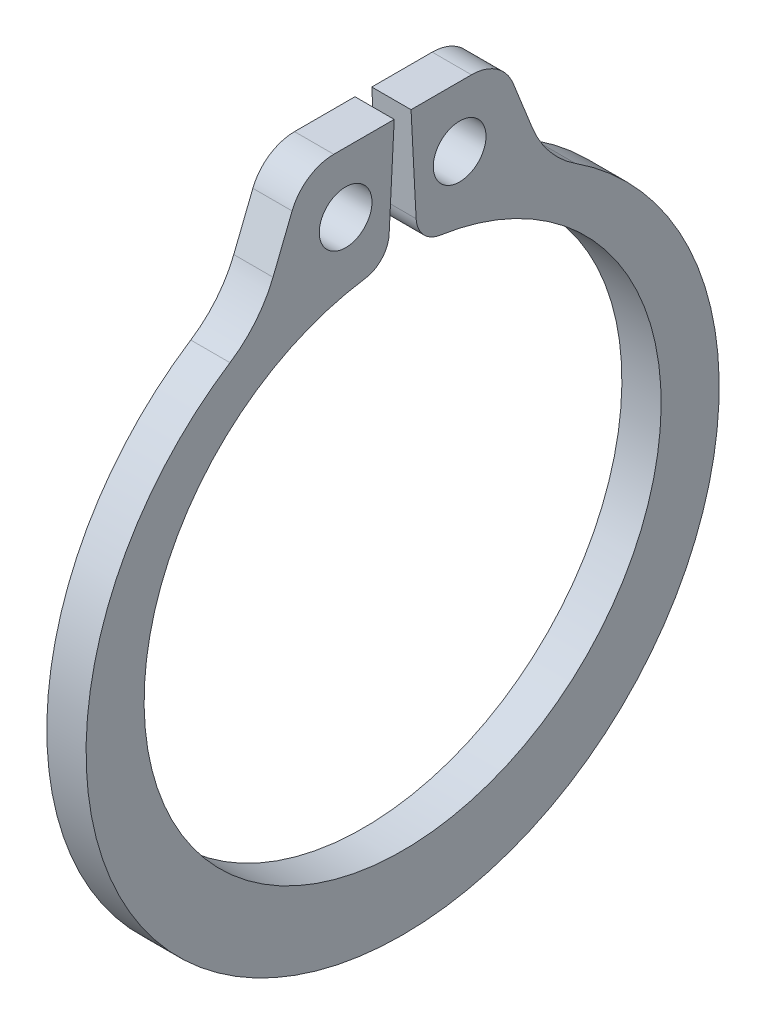
ISO-10303-21;
HEADER;
FILE_DESCRIPTION(('STEP AP214'),'2;1');
FILE_NAME('part.step','',(''),(''),'','','');
FILE_SCHEMA(('AUTOMOTIVE_DESIGN { 1 0 10303 214 1 1 1 1 }'));
ENDSEC;
DATA;
#1=APPLICATION_CONTEXT('core data for automotive mechanical design processes');
#2=APPLICATION_PROTOCOL_DEFINITION('international standard','automotive_design',2000,#1);
#3=PRODUCT_CONTEXT('',#1,'mechanical');
#4=PRODUCT('Part','Part','',(#3));
#5=PRODUCT_RELATED_PRODUCT_CATEGORY('part','',(#4));
#6=PRODUCT_DEFINITION_FORMATION('','',#4);
#7=PRODUCT_DEFINITION_CONTEXT('part definition',#1,'design');
#8=PRODUCT_DEFINITION('design','',#6,#7);
#9=PRODUCT_DEFINITION_SHAPE('','',#8);
#10=(LENGTH_UNIT() NAMED_UNIT(*) SI_UNIT(.MILLI.,.METRE.));
#11=(NAMED_UNIT(*) PLANE_ANGLE_UNIT() SI_UNIT($,.RADIAN.));
#12=(NAMED_UNIT(*) SI_UNIT($,.STERADIAN.) SOLID_ANGLE_UNIT());
#13=UNCERTAINTY_MEASURE_WITH_UNIT(LENGTH_MEASURE(1.E-05),#10,'distance_accuracy_value','');
#14=(GEOMETRIC_REPRESENTATION_CONTEXT(3) GLOBAL_UNCERTAINTY_ASSIGNED_CONTEXT((#13)) GLOBAL_UNIT_ASSIGNED_CONTEXT((#10,
#11,#12)) REPRESENTATION_CONTEXT('',''));
#15=CARTESIAN_POINT('',(0.,0.,0.));
#16=DIRECTION('',(0.,0.,1.));
#17=DIRECTION('',(1.,0.,0.));
#18=AXIS2_PLACEMENT_3D('',#15,#16,#17);
#19=CARTESIAN_POINT('',(0.4445,-0.336753666382073,0.));
#20=DIRECTION('',(1.,0.,0.));
#21=DIRECTION('',(0.,0.,-1.));
#22=AXIS2_PLACEMENT_3D('',#19,#20,#21);
#23=PLANE('',#22);
#24=CARTESIAN_POINT('',(0.4445,7.21488157342687,1.29098399758281));
#25=DIRECTION('',(1.,0.,0.));
#26=DIRECTION('',(0.,0.,-1.));
#27=AXIS2_PLACEMENT_3D('',#24,#25,#26);
#28=CIRCLE('',#27,0.5969);
#29=CARTESIAN_POINT('',(0.4445,7.21488157342687,0.694083997582812));
#30=VERTEX_POINT('',#29);
#31=EDGE_CURVE('E181',#30,#30,#28,.T.);
#32=ORIENTED_EDGE('',*,*,#31,.F.);
#33=EDGE_LOOP('',(#32));
#34=FACE_BOUND('',#33,.T.);
#35=DIRECTION('',(0.,0.928920919133525,0.370278173804678));
#36=VECTOR('',#35,1.);
#37=CARTESIAN_POINT('',(0.4445,8.58460184329625,-2.2479));
#38=LINE('',#37,#36);
#39=CARTESIAN_POINT('',(0.4445,6.86113480548332,-2.93489306284241));
#40=VERTEX_POINT('',#39);
#41=CARTESIAN_POINT('',(0.4445,7.9448044678818,-2.50293032485743));
#42=VERTEX_POINT('',#41);
#43=EDGE_CURVE('E187',#40,#42,#38,.T.);
#44=ORIENTED_EDGE('',*,*,#43,.T.);
#45=CARTESIAN_POINT('',(0.4445,7.56860184329625,-1.55914667101777));
#46=DIRECTION('',(1.,0.,0.));
#47=DIRECTION('',(0.,0.,-1.));
#48=AXIS2_PLACEMENT_3D('',#45,#46,#47);
#49=CIRCLE('',#48,1.016);
#50=CARTESIAN_POINT('',(0.4445,8.58460184329625,-1.55914667101777));
#51=VERTEX_POINT('',#50);
#52=EDGE_CURVE('E248',#42,#51,#49,.T.);
#53=ORIENTED_EDGE('',*,*,#52,.T.);
#54=DIRECTION('',(0.,0.,1.));
#55=VECTOR('',#54,1.);
#56=CARTESIAN_POINT('',(0.4445,8.58460184329625,-0.1905));
#57=LINE('',#56,#55);
#58=CARTESIAN_POINT('',(0.4445,8.58460184329625,-0.1905));
#59=VERTEX_POINT('',#58);
#60=EDGE_CURVE('E190',#51,#59,#57,.T.);
#61=ORIENTED_EDGE('',*,*,#60,.T.);
#62=DIRECTION('',(0.,-0.998629534754574,-0.0523359562429374));
#63=VECTOR('',#62,1.);
#64=CARTESIAN_POINT('',(0.4445,8.58460184329625,-0.1905));
#65=LINE('',#64,#63);
#66=CARTESIAN_POINT('',(0.4445,6.38806597718214,-0.305615566858578));
#67=VERTEX_POINT('',#66);
#68=EDGE_CURVE('E159',#59,#67,#65,.T.);
#69=ORIENTED_EDGE('',*,*,#68,.T.);
#70=CARTESIAN_POINT('',(0.4445,6.4212993093964,-0.939745321427733));
#71=DIRECTION('',(1.,0.,0.));
#72=DIRECTION('',(0.,0.,-1.));
#73=AXIS2_PLACEMENT_3D('',#70,#71,#72);
#74=CIRCLE('',#73,0.635);
#75=CARTESIAN_POINT('',(0.4445,5.79299213626564,-0.847793724419148));
#76=VERTEX_POINT('',#75);
#77=EDGE_CURVE('E235',#67,#76,#74,.T.);
#78=ORIENTED_EDGE('',*,*,#77,.T.);
#79=CARTESIAN_POINT('',(0.4445,0.,0.));
#80=DIRECTION('',(-1.,0.,0.));
#81=DIRECTION('',(0.,0.,-1.));
#82=AXIS2_PLACEMENT_3D('',#79,#80,#81);
#83=CIRCLE('',#82,5.8547);
#84=CARTESIAN_POINT('',(0.4445,5.79299213626564,0.847793724419148));
#85=VERTEX_POINT('',#84);
#86=EDGE_CURVE('E193',#76,#85,#83,.T.);
#87=ORIENTED_EDGE('',*,*,#86,.T.);
#88=CARTESIAN_POINT('',(0.4445,6.4212993093964,0.939745321427733));
#89=DIRECTION('',(1.,0.,0.));
#90=DIRECTION('',(0.,0.,-1.));
#91=AXIS2_PLACEMENT_3D('',#88,#89,#90);
#92=CIRCLE('',#91,0.635);
#93=CARTESIAN_POINT('',(0.4445,6.38806597718214,0.305615566858577));
#94=VERTEX_POINT('',#93);
#95=EDGE_CURVE('E233',#85,#94,#92,.T.);
#96=ORIENTED_EDGE('',*,*,#95,.T.);
#97=DIRECTION('',(0.,0.998629534754574,-0.0523359562429371));
#98=VECTOR('',#97,1.);
#99=CARTESIAN_POINT('',(0.4445,5.8451613035575,0.334067995165625));
#100=LINE('',#99,#98);
#101=CARTESIAN_POINT('',(0.4445,8.58460184329625,0.1905));
#102=VERTEX_POINT('',#101);
#103=EDGE_CURVE('E196',#94,#102,#100,.T.);
#104=ORIENTED_EDGE('',*,*,#103,.T.);
#105=DIRECTION('',(0.,0.,1.));
#106=VECTOR('',#105,1.);
#107=CARTESIAN_POINT('',(0.4445,8.58460184329625,0.1905));
#108=LINE('',#107,#106);
#109=CARTESIAN_POINT('',(0.4445,8.58460184329625,1.55914667101777));
#110=VERTEX_POINT('',#109);
#111=EDGE_CURVE('E198',#102,#110,#108,.T.);
#112=ORIENTED_EDGE('',*,*,#111,.T.);
#113=CARTESIAN_POINT('',(0.4445,7.56860184329625,1.55914667101777));
#114=DIRECTION('',(1.,0.,0.));
#115=DIRECTION('',(0.,0.,-1.));
#116=AXIS2_PLACEMENT_3D('',#113,#114,#115);
#117=CIRCLE('',#116,1.016);
#118=CARTESIAN_POINT('',(0.4445,7.9448044678818,2.50293032485743));
#119=VERTEX_POINT('',#118);
#120=EDGE_CURVE('E54',#110,#119,#117,.T.);
#121=ORIENTED_EDGE('',*,*,#120,.T.);
#122=DIRECTION('',(0.,-0.928920919133524,0.370278173804679));
#123=VECTOR('',#122,1.);
#124=CARTESIAN_POINT('',(0.4445,8.58460184329625,2.2479));
#125=LINE('',#124,#123);
#126=CARTESIAN_POINT('',(0.4445,6.86113480548332,2.93489306284241));
#127=VERTEX_POINT('',#126);
#128=EDGE_CURVE('E200',#119,#127,#125,.T.);
#129=ORIENTED_EDGE('',*,*,#128,.T.);
#130=CARTESIAN_POINT('',(0.4445,7.8016413669472,5.29435219744157));
#131=DIRECTION('',(1.,0.,0.));
#132=DIRECTION('',(0.,0.,-1.));
#133=AXIS2_PLACEMENT_3D('',#130,#131,#132);
#134=CIRCLE('',#133,2.54);
#135=CARTESIAN_POINT('',(0.4445,5.67252017558994,3.90927351645863));
#136=VERTEX_POINT('',#135);
#137=EDGE_CURVE('E221',#127,#136,#134,.F.);
#138=ORIENTED_EDGE('',*,*,#137,.T.);
#139=CARTESIAN_POINT('',(0.4445,-0.336753666382073,0.));
#140=DIRECTION('',(1.,0.,0.));
#141=DIRECTION('',(0.,0.,-1.));
#142=AXIS2_PLACEMENT_3D('',#139,#140,#141);
#143=CIRCLE('',#142,7.16894633361793);
#144=CARTESIAN_POINT('',(0.4445,5.67252017558994,-3.90927351645864));
#145=VERTEX_POINT('',#144);
#146=EDGE_CURVE('E184',#136,#145,#143,.T.);
#147=ORIENTED_EDGE('',*,*,#146,.T.);
#148=CARTESIAN_POINT('',(0.4445,7.8016413669472,-5.29435219744157));
#149=DIRECTION('',(1.,0.,0.));
#150=DIRECTION('',(0.,0.,-1.));
#151=AXIS2_PLACEMENT_3D('',#148,#149,#150);
#152=CIRCLE('',#151,2.54);
#153=EDGE_CURVE('E216',#145,#40,#152,.F.);
#154=ORIENTED_EDGE('',*,*,#153,.T.);
#155=EDGE_LOOP('',(#44,#53,#61,#69,#78,#87,#96,#104,#112,#121,#129,#138,#147,#154));
#156=FACE_BOUND('',#155,.T.);
#157=CARTESIAN_POINT('',(0.4445,7.21488157342687,-1.29098399758281));
#158=DIRECTION('',(1.,0.,0.));
#159=DIRECTION('',(0.,0.,-1.));
#160=AXIS2_PLACEMENT_3D('',#157,#158,#159);
#161=CIRCLE('',#160,0.5969);
#162=CARTESIAN_POINT('',(0.4445,7.21488157342687,-1.88788399758281));
#163=VERTEX_POINT('',#162);
#164=EDGE_CURVE('E178',#163,#163,#161,.T.);
#165=ORIENTED_EDGE('',*,*,#164,.F.);
#166=EDGE_LOOP('',(#165));
#167=FACE_BOUND('',#166,.T.);
#168=ADVANCED_FACE('F39',(#34,#156,#167),#23,.T.);
#169=CARTESIAN_POINT('',(0.4445,-0.336753666382073,0.));
#170=DIRECTION('',(-1.,0.,0.));
#171=DIRECTION('',(0.,0.,1.));
#172=AXIS2_PLACEMENT_3D('',#169,#170,#171);
#173=CYLINDRICAL_SURFACE('',#172,7.16894633361793);
#174=CARTESIAN_POINT('',(-0.4445,-0.336753666382073,0.));
#175=DIRECTION('',(1.,0.,0.));
#176=DIRECTION('',(0.,0.,-1.));
#177=AXIS2_PLACEMENT_3D('',#174,#175,#176);
#178=CIRCLE('',#177,7.16894633361793);
#179=CARTESIAN_POINT('',(-0.4445,5.67252017558994,3.90927351645863));
#180=VERTEX_POINT('',#179);
#181=CARTESIAN_POINT('',(-0.4445,5.67252017558994,-3.90927351645864));
#182=VERTEX_POINT('',#181);
#183=EDGE_CURVE('E259',#180,#182,#178,.T.);
#184=ORIENTED_EDGE('',*,*,#183,.T.);
#185=DIRECTION('',(-1.,0.,0.));
#186=VECTOR('',#185,1.);
#187=CARTESIAN_POINT('',(0.4445,5.67252017558994,-3.90927351645864));
#188=LINE('',#187,#186);
#189=EDGE_CURVE('E209',#182,#145,#188,.F.);
#190=ORIENTED_EDGE('',*,*,#189,.T.);
#191=ORIENTED_EDGE('',*,*,#146,.F.);
#192=DIRECTION('',(-1.,0.,0.));
#193=VECTOR('',#192,1.);
#194=CARTESIAN_POINT('',(0.4445,5.67252017558994,3.90927351645863));
#195=LINE('',#194,#193);
#196=EDGE_CURVE('E206',#136,#180,#195,.T.);
#197=ORIENTED_EDGE('',*,*,#196,.T.);
#198=EDGE_LOOP('',(#184,#190,#191,#197));
#199=FACE_BOUND('',#198,.T.);
#200=ADVANCED_FACE('F268',(#199),#173,.T.);
#201=CARTESIAN_POINT('',(0.4445,8.58460184329625,-2.2479));
#202=DIRECTION('',(0.,-0.370278173804678,0.928920919133525));
#203=DIRECTION('',(0.,-0.928920919133525,-0.370278173804678));
#204=AXIS2_PLACEMENT_3D('',#201,#202,#203);
#205=PLANE('',#204);
#206=DIRECTION('',(0.,0.928920919133525,0.370278173804678));
#207=VECTOR('',#206,1.);
#208=CARTESIAN_POINT('',(-0.4445,8.58460184329625,-2.2479));
#209=LINE('',#208,#207);
#210=CARTESIAN_POINT('',(-0.4445,6.86113480548332,-2.93489306284241));
#211=VERTEX_POINT('',#210);
#212=CARTESIAN_POINT('',(-0.4445,7.9448044678818,-2.50293032485743));
#213=VERTEX_POINT('',#212);
#214=EDGE_CURVE('E152',#211,#213,#209,.T.);
#215=ORIENTED_EDGE('',*,*,#214,.T.);
#216=DIRECTION('',(-1.,0.,0.));
#217=VECTOR('',#216,1.);
#218=CARTESIAN_POINT('',(0.4445,7.9448044678818,-2.50293032485743));
#219=LINE('',#218,#217);
#220=EDGE_CURVE('E245',#213,#42,#219,.F.);
#221=ORIENTED_EDGE('',*,*,#220,.T.);
#222=ORIENTED_EDGE('',*,*,#43,.F.);
#223=DIRECTION('',(1.,0.,0.));
#224=VECTOR('',#223,1.);
#225=CARTESIAN_POINT('',(-0.4445,6.86113480548332,-2.93489306284241));
#226=LINE('',#225,#224);
#227=EDGE_CURVE('E160',#40,#211,#226,.F.);
#228=ORIENTED_EDGE('',*,*,#227,.T.);
#229=EDGE_LOOP('',(#215,#221,#222,#228));
#230=FACE_BOUND('',#229,.T.);
#231=ADVANCED_FACE('F277',(#230),#205,.F.);
#232=CARTESIAN_POINT('',(0.4445,8.58460184329625,-0.1905));
#233=DIRECTION('',(0.,-1.,0.));
#234=DIRECTION('',(0.,0.,-1.));
#235=AXIS2_PLACEMENT_3D('',#232,#233,#234);
#236=PLANE('',#235);
#237=ORIENTED_EDGE('',*,*,#60,.F.);
#238=DIRECTION('',(-1.,0.,0.));
#239=VECTOR('',#238,1.);
#240=CARTESIAN_POINT('',(0.4445,8.58460184329625,-1.55914667101777));
#241=LINE('',#240,#239);
#242=CARTESIAN_POINT('',(-0.4445,8.58460184329625,-1.55914667101777));
#243=VERTEX_POINT('',#242);
#244=EDGE_CURVE('E148',#51,#243,#241,.T.);
#245=ORIENTED_EDGE('',*,*,#244,.T.);
#246=DIRECTION('',(0.,0.,1.));
#247=VECTOR('',#246,1.);
#248=CARTESIAN_POINT('',(-0.4445,8.58460184329625,-0.1905));
#249=LINE('',#248,#247);
#250=CARTESIAN_POINT('',(-0.4445,8.58460184329625,-0.1905));
#251=VERTEX_POINT('',#250);
#252=EDGE_CURVE('E141',#243,#251,#249,.T.);
#253=ORIENTED_EDGE('',*,*,#252,.T.);
#254=DIRECTION('',(-1.,0.,0.));
#255=VECTOR('',#254,1.);
#256=CARTESIAN_POINT('',(0.4445,8.58460184329625,-0.1905));
#257=LINE('',#256,#255);
#258=EDGE_CURVE('E145',#59,#251,#257,.T.);
#259=ORIENTED_EDGE('',*,*,#258,.F.);
#260=EDGE_LOOP('',(#237,#245,#253,#259));
#261=FACE_BOUND('',#260,.T.);
#262=ADVANCED_FACE('F144',(#261),#236,.F.);
#263=CARTESIAN_POINT('',(0.4445,8.58460184329625,-0.1905));
#264=DIRECTION('',(0.,0.0523359562429374,-0.998629534754574));
#265=DIRECTION('',(0.,0.998629534754574,0.0523359562429374));
#266=AXIS2_PLACEMENT_3D('',#263,#264,#265);
#267=PLANE('',#266);
#268=DIRECTION('',(0.,-0.998629534754574,-0.0523359562429374));
#269=VECTOR('',#268,1.);
#270=CARTESIAN_POINT('',(-0.4445,8.58460184329625,-0.1905));
#271=LINE('',#270,#269);
#272=CARTESIAN_POINT('',(-0.4445,6.38806597718214,-0.305615566858578));
#273=VERTEX_POINT('',#272);
#274=EDGE_CURVE('E151',#251,#273,#271,.T.);
#275=ORIENTED_EDGE('',*,*,#274,.T.);
#276=DIRECTION('',(-1.,0.,0.));
#277=VECTOR('',#276,1.);
#278=CARTESIAN_POINT('',(0.4445,6.38806597718214,-0.305615566858578));
#279=LINE('',#278,#277);
#280=EDGE_CURVE('E231',#273,#67,#279,.F.);
#281=ORIENTED_EDGE('',*,*,#280,.T.);
#282=ORIENTED_EDGE('',*,*,#68,.F.);
#283=ORIENTED_EDGE('',*,*,#258,.T.);
#284=EDGE_LOOP('',(#275,#281,#282,#283));
#285=FACE_BOUND('',#284,.T.);
#286=ADVANCED_FACE('F156',(#285),#267,.F.);
#287=CARTESIAN_POINT('',(0.4445,0.,0.));
#288=DIRECTION('',(-1.,0.,0.));
#289=DIRECTION('',(0.,0.,1.));
#290=AXIS2_PLACEMENT_3D('',#287,#288,#289);
#291=CYLINDRICAL_SURFACE('',#290,5.8547);
#292=ORIENTED_EDGE('',*,*,#86,.F.);
#293=DIRECTION('',(-1.,0.,0.));
#294=VECTOR('',#293,1.);
#295=CARTESIAN_POINT('',(0.4445,5.79299213626564,-0.847793724419148));
#296=LINE('',#295,#294);
#297=CARTESIAN_POINT('',(-0.4445,5.79299213626564,-0.847793724419148));
#298=VERTEX_POINT('',#297);
#299=EDGE_CURVE('E225',#76,#298,#296,.T.);
#300=ORIENTED_EDGE('',*,*,#299,.T.);
#301=CARTESIAN_POINT('',(-0.4445,0.,0.));
#302=DIRECTION('',(-1.,0.,0.));
#303=DIRECTION('',(0.,0.,-1.));
#304=AXIS2_PLACEMENT_3D('',#301,#302,#303);
#305=CIRCLE('',#304,5.8547);
#306=CARTESIAN_POINT('',(-0.4445,5.79299213626564,0.847793724419148));
#307=VERTEX_POINT('',#306);
#308=EDGE_CURVE('E166',#298,#307,#305,.T.);
#309=ORIENTED_EDGE('',*,*,#308,.T.);
#310=DIRECTION('',(-1.,0.,0.));
#311=VECTOR('',#310,1.);
#312=CARTESIAN_POINT('',(0.4445,5.79299213626564,0.847793724419148));
#313=LINE('',#312,#311);
#314=EDGE_CURVE('E223',#307,#85,#313,.F.);
#315=ORIENTED_EDGE('',*,*,#314,.T.);
#316=EDGE_LOOP('',(#292,#300,#309,#315));
#317=FACE_BOUND('',#316,.T.);
#318=ADVANCED_FACE('F288',(#317),#291,.F.);
#319=CARTESIAN_POINT('',(0.4445,5.8451613035575,0.334067995165625));
#320=DIRECTION('',(0.,0.0523359562429371,0.998629534754574));
#321=DIRECTION('',(0.,-0.998629534754574,0.0523359562429371));
#322=AXIS2_PLACEMENT_3D('',#319,#320,#321);
#323=PLANE('',#322);
#324=ORIENTED_EDGE('',*,*,#103,.F.);
#325=DIRECTION('',(-1.,0.,0.));
#326=VECTOR('',#325,1.);
#327=CARTESIAN_POINT('',(0.4445,6.38806597718214,0.305615566858577));
#328=LINE('',#327,#326);
#329=CARTESIAN_POINT('',(-0.4445,6.38806597718214,0.305615566858577));
#330=VERTEX_POINT('',#329);
#331=EDGE_CURVE('E237',#94,#330,#328,.T.);
#332=ORIENTED_EDGE('',*,*,#331,.T.);
#333=DIRECTION('',(0.,0.998629534754574,-0.0523359562429371));
#334=VECTOR('',#333,1.);
#335=CARTESIAN_POINT('',(-0.4445,5.8451613035575,0.334067995165625));
#336=LINE('',#335,#334);
#337=CARTESIAN_POINT('',(-0.4445,8.58460184329625,0.1905));
#338=VERTEX_POINT('',#337);
#339=EDGE_CURVE('E169',#330,#338,#336,.T.);
#340=ORIENTED_EDGE('',*,*,#339,.T.);
#341=DIRECTION('',(-1.,0.,0.));
#342=VECTOR('',#341,1.);
#343=CARTESIAN_POINT('',(0.4445,8.58460184329625,0.1905));
#344=LINE('',#343,#342);
#345=EDGE_CURVE('E161',#102,#338,#344,.T.);
#346=ORIENTED_EDGE('',*,*,#345,.F.);
#347=EDGE_LOOP('',(#324,#332,#340,#346));
#348=FACE_BOUND('',#347,.T.);
#349=ADVANCED_FACE('F297',(#348),#323,.F.);
#350=CARTESIAN_POINT('',(0.4445,8.58460184329625,0.1905));
#351=DIRECTION('',(0.,-1.,0.));
#352=DIRECTION('',(0.,0.,-1.));
#353=AXIS2_PLACEMENT_3D('',#350,#351,#352);
#354=PLANE('',#353);
#355=DIRECTION('',(0.,0.,1.));
#356=VECTOR('',#355,1.);
#357=CARTESIAN_POINT('',(-0.4445,8.58460184329625,0.1905));
#358=LINE('',#357,#356);
#359=CARTESIAN_POINT('',(-0.4445,8.58460184329625,1.55914667101777));
#360=VERTEX_POINT('',#359);
#361=EDGE_CURVE('E174',#338,#360,#358,.T.);
#362=ORIENTED_EDGE('',*,*,#361,.T.);
#363=DIRECTION('',(-1.,0.,0.));
#364=VECTOR('',#363,1.);
#365=CARTESIAN_POINT('',(0.4445,8.58460184329625,1.55914667101777));
#366=LINE('',#365,#364);
#367=EDGE_CURVE('E11',#360,#110,#366,.F.);
#368=ORIENTED_EDGE('',*,*,#367,.T.);
#369=ORIENTED_EDGE('',*,*,#111,.F.);
#370=ORIENTED_EDGE('',*,*,#345,.T.);
#371=EDGE_LOOP('',(#362,#368,#369,#370));
#372=FACE_BOUND('',#371,.T.);
#373=ADVANCED_FACE('F317',(#372),#354,.F.);
#374=CARTESIAN_POINT('',(0.4445,8.58460184329625,2.2479));
#375=DIRECTION('',(0.,-0.370278173804679,-0.928920919133524));
#376=DIRECTION('',(0.,0.928920919133525,-0.370278173804679));
#377=AXIS2_PLACEMENT_3D('',#374,#375,#376);
#378=PLANE('',#377);
#379=ORIENTED_EDGE('',*,*,#128,.F.);
#380=DIRECTION('',(-1.,0.,0.));
#381=VECTOR('',#380,1.);
#382=CARTESIAN_POINT('',(0.4445,7.9448044678818,2.50293032485743));
#383=LINE('',#382,#381);
#384=CARTESIAN_POINT('',(-0.4445,7.9448044678818,2.50293032485743));
#385=VERTEX_POINT('',#384);
#386=EDGE_CURVE('E47',#119,#385,#383,.T.);
#387=ORIENTED_EDGE('',*,*,#386,.T.);
#388=DIRECTION('',(0.,-0.928920919133524,0.370278173804679));
#389=VECTOR('',#388,1.);
#390=CARTESIAN_POINT('',(-0.4445,8.58460184329625,2.2479));
#391=LINE('',#390,#389);
#392=CARTESIAN_POINT('',(-0.4445,6.86113480548332,2.93489306284241));
#393=VERTEX_POINT('',#392);
#394=EDGE_CURVE('E176',#385,#393,#391,.T.);
#395=ORIENTED_EDGE('',*,*,#394,.T.);
#396=DIRECTION('',(1.,0.,0.));
#397=VECTOR('',#396,1.);
#398=CARTESIAN_POINT('',(0.4445,6.86113480548332,2.93489306284241));
#399=LINE('',#398,#397);
#400=EDGE_CURVE('E211',#393,#127,#399,.T.);
#401=ORIENTED_EDGE('',*,*,#400,.T.);
#402=EDGE_LOOP('',(#379,#387,#395,#401));
#403=FACE_BOUND('',#402,.T.);
#404=ADVANCED_FACE('F253',(#403),#378,.F.);
#405=CARTESIAN_POINT('',(0.4445,7.21488157342687,1.29098399758281));
#406=DIRECTION('',(-1.,0.,0.));
#407=DIRECTION('',(0.,0.,1.));
#408=AXIS2_PLACEMENT_3D('',#405,#406,#407);
#409=CYLINDRICAL_SURFACE('',#408,0.5969);
#410=ORIENTED_EDGE('',*,*,#31,.T.);
#411=EDGE_LOOP('',(#410));
#412=FACE_BOUND('',#411,.T.);
#413=CARTESIAN_POINT('',(-0.4445,7.21488157342687,1.29098399758281));
#414=DIRECTION('',(1.,0.,0.));
#415=DIRECTION('',(0.,0.,-1.));
#416=AXIS2_PLACEMENT_3D('',#413,#414,#415);
#417=CIRCLE('',#416,0.5969);
#418=CARTESIAN_POINT('',(-0.4445,7.21488157342687,0.694083997582812));
#419=VERTEX_POINT('',#418);
#420=EDGE_CURVE('E452',#419,#419,#417,.T.);
#421=ORIENTED_EDGE('',*,*,#420,.F.);
#422=EDGE_LOOP('',(#421));
#423=FACE_BOUND('',#422,.T.);
#424=ADVANCED_FACE('F313',(#412,#423),#409,.F.);
#425=CARTESIAN_POINT('',(0.4445,7.21488157342687,-1.29098399758281));
#426=DIRECTION('',(-1.,0.,0.));
#427=DIRECTION('',(0.,0.,1.));
#428=AXIS2_PLACEMENT_3D('',#425,#426,#427);
#429=CYLINDRICAL_SURFACE('',#428,0.5969);
#430=ORIENTED_EDGE('',*,*,#164,.T.);
#431=EDGE_LOOP('',(#430));
#432=FACE_BOUND('',#431,.T.);
#433=CARTESIAN_POINT('',(-0.4445,7.21488157342687,-1.29098399758281));
#434=DIRECTION('',(1.,0.,0.));
#435=DIRECTION('',(0.,0.,-1.));
#436=AXIS2_PLACEMENT_3D('',#433,#434,#435);
#437=CIRCLE('',#436,0.5969);
#438=CARTESIAN_POINT('',(-0.4445,7.21488157342687,-1.88788399758281));
#439=VERTEX_POINT('',#438);
#440=EDGE_CURVE('E454',#439,#439,#437,.T.);
#441=ORIENTED_EDGE('',*,*,#440,.F.);
#442=EDGE_LOOP('',(#441));
#443=FACE_BOUND('',#442,.T.);
#444=ADVANCED_FACE('F358',(#432,#443),#429,.F.);
#445=CARTESIAN_POINT('',(-0.4445,-0.336753666382073,0.));
#446=DIRECTION('',(1.,0.,0.));
#447=DIRECTION('',(0.,0.,-1.));
#448=AXIS2_PLACEMENT_3D('',#445,#446,#447);
#449=PLANE('',#448);
#450=ORIENTED_EDGE('',*,*,#440,.T.);
#451=EDGE_LOOP('',(#450));
#452=FACE_BOUND('',#451,.T.);
#453=ORIENTED_EDGE('',*,*,#420,.T.);
#454=EDGE_LOOP('',(#453));
#455=FACE_BOUND('',#454,.T.);
#456=ORIENTED_EDGE('',*,*,#252,.F.);
#457=CARTESIAN_POINT('',(-0.4445,7.56860184329625,-1.55914667101777));
#458=DIRECTION('',(1.,0.,0.));
#459=DIRECTION('',(0.,0.,-1.));
#460=AXIS2_PLACEMENT_3D('',#457,#458,#459);
#461=CIRCLE('',#460,1.016);
#462=EDGE_CURVE('E243',#243,#213,#461,.F.);
#463=ORIENTED_EDGE('',*,*,#462,.T.);
#464=ORIENTED_EDGE('',*,*,#214,.F.);
#465=CARTESIAN_POINT('',(-0.4445,7.8016413669472,-5.29435219744157));
#466=DIRECTION('',(1.,0.,0.));
#467=DIRECTION('',(0.,0.,-1.));
#468=AXIS2_PLACEMENT_3D('',#465,#466,#467);
#469=CIRCLE('',#468,2.54);
#470=EDGE_CURVE('E214',#211,#182,#469,.T.);
#471=ORIENTED_EDGE('',*,*,#470,.T.);
#472=ORIENTED_EDGE('',*,*,#183,.F.);
#473=CARTESIAN_POINT('',(-0.4445,7.8016413669472,5.29435219744157));
#474=DIRECTION('',(1.,0.,0.));
#475=DIRECTION('',(0.,0.,-1.));
#476=AXIS2_PLACEMENT_3D('',#473,#474,#475);
#477=CIRCLE('',#476,2.54);
#478=EDGE_CURVE('E218',#180,#393,#477,.T.);
#479=ORIENTED_EDGE('',*,*,#478,.T.);
#480=ORIENTED_EDGE('',*,*,#394,.F.);
#481=CARTESIAN_POINT('',(-0.4445,7.56860184329625,1.55914667101777));
#482=DIRECTION('',(1.,0.,0.));
#483=DIRECTION('',(0.,0.,-1.));
#484=AXIS2_PLACEMENT_3D('',#481,#482,#483);
#485=CIRCLE('',#484,1.016);
#486=EDGE_CURVE('E241',#385,#360,#485,.F.);
#487=ORIENTED_EDGE('',*,*,#486,.T.);
#488=ORIENTED_EDGE('',*,*,#361,.F.);
#489=ORIENTED_EDGE('',*,*,#339,.F.);
#490=CARTESIAN_POINT('',(-0.4445,6.4212993093964,0.939745321427733));
#491=DIRECTION('',(1.,0.,0.));
#492=DIRECTION('',(0.,0.,-1.));
#493=AXIS2_PLACEMENT_3D('',#490,#491,#492);
#494=CIRCLE('',#493,0.635);
#495=EDGE_CURVE('E228',#330,#307,#494,.F.);
#496=ORIENTED_EDGE('',*,*,#495,.T.);
#497=ORIENTED_EDGE('',*,*,#308,.F.);
#498=CARTESIAN_POINT('',(-0.4445,6.4212993093964,-0.939745321427733));
#499=DIRECTION('',(1.,0.,0.));
#500=DIRECTION('',(0.,0.,-1.));
#501=AXIS2_PLACEMENT_3D('',#498,#499,#500);
#502=CIRCLE('',#501,0.635);
#503=EDGE_CURVE('E165',#298,#273,#502,.F.);
#504=ORIENTED_EDGE('',*,*,#503,.T.);
#505=ORIENTED_EDGE('',*,*,#274,.F.);
#506=EDGE_LOOP('',(#456,#463,#464,#471,#472,#479,#480,#487,#488,#489,#496,#497,#504,#505));
#507=FACE_BOUND('',#506,.T.);
#508=ADVANCED_FACE('F163',(#452,#455,#507),#449,.F.);
#509=CARTESIAN_POINT('',(0.4445,7.8016413669472,-5.29435219744157));
#510=DIRECTION('',(-1.,0.,0.));
#511=DIRECTION('',(0.,0.,1.));
#512=AXIS2_PLACEMENT_3D('',#509,#510,#511);
#513=CYLINDRICAL_SURFACE('',#512,2.54);
#514=ORIENTED_EDGE('',*,*,#153,.F.);
#515=ORIENTED_EDGE('',*,*,#189,.F.);
#516=ORIENTED_EDGE('',*,*,#470,.F.);
#517=ORIENTED_EDGE('',*,*,#227,.F.);
#518=EDGE_LOOP('',(#514,#515,#516,#517));
#519=FACE_BOUND('',#518,.T.);
#520=ADVANCED_FACE('F271',(#519),#513,.F.);
#521=CARTESIAN_POINT('',(0.4445,7.8016413669472,5.29435219744157));
#522=DIRECTION('',(-1.,0.,0.));
#523=DIRECTION('',(0.,0.,1.));
#524=AXIS2_PLACEMENT_3D('',#521,#522,#523);
#525=CYLINDRICAL_SURFACE('',#524,2.54);
#526=ORIENTED_EDGE('',*,*,#137,.F.);
#527=ORIENTED_EDGE('',*,*,#400,.F.);
#528=ORIENTED_EDGE('',*,*,#478,.F.);
#529=ORIENTED_EDGE('',*,*,#196,.F.);
#530=EDGE_LOOP('',(#526,#527,#528,#529));
#531=FACE_BOUND('',#530,.T.);
#532=ADVANCED_FACE('F263',(#531),#525,.F.);
#533=CARTESIAN_POINT('',(0.4445,6.4212993093964,-0.939745321427733));
#534=DIRECTION('',(-1.,0.,0.));
#535=DIRECTION('',(0.,0.,1.));
#536=AXIS2_PLACEMENT_3D('',#533,#534,#535);
#537=CYLINDRICAL_SURFACE('',#536,0.635);
#538=ORIENTED_EDGE('',*,*,#77,.F.);
#539=ORIENTED_EDGE('',*,*,#280,.F.);
#540=ORIENTED_EDGE('',*,*,#503,.F.);
#541=ORIENTED_EDGE('',*,*,#299,.F.);
#542=EDGE_LOOP('',(#538,#539,#540,#541));
#543=FACE_BOUND('',#542,.T.);
#544=ADVANCED_FACE('F286',(#543),#537,.T.);
#545=CARTESIAN_POINT('',(0.4445,6.4212993093964,0.939745321427733));
#546=DIRECTION('',(-1.,0.,0.));
#547=DIRECTION('',(0.,0.,1.));
#548=AXIS2_PLACEMENT_3D('',#545,#546,#547);
#549=CYLINDRICAL_SURFACE('',#548,0.635);
#550=ORIENTED_EDGE('',*,*,#95,.F.);
#551=ORIENTED_EDGE('',*,*,#314,.F.);
#552=ORIENTED_EDGE('',*,*,#495,.F.);
#553=ORIENTED_EDGE('',*,*,#331,.F.);
#554=EDGE_LOOP('',(#550,#551,#552,#553));
#555=FACE_BOUND('',#554,.T.);
#556=ADVANCED_FACE('F294',(#555),#549,.T.);
#557=CARTESIAN_POINT('',(0.4445,7.56860184329625,-1.55914667101777));
#558=DIRECTION('',(-1.,0.,0.));
#559=DIRECTION('',(0.,0.,1.));
#560=AXIS2_PLACEMENT_3D('',#557,#558,#559);
#561=CYLINDRICAL_SURFACE('',#560,1.016);
#562=ORIENTED_EDGE('',*,*,#52,.F.);
#563=ORIENTED_EDGE('',*,*,#220,.F.);
#564=ORIENTED_EDGE('',*,*,#462,.F.);
#565=ORIENTED_EDGE('',*,*,#244,.F.);
#566=EDGE_LOOP('',(#562,#563,#564,#565));
#567=FACE_BOUND('',#566,.T.);
#568=ADVANCED_FACE('F281',(#567),#561,.T.);
#569=CARTESIAN_POINT('',(0.4445,7.56860184329625,1.55914667101777));
#570=DIRECTION('',(-1.,0.,0.));
#571=DIRECTION('',(0.,0.,1.));
#572=AXIS2_PLACEMENT_3D('',#569,#570,#571);
#573=CYLINDRICAL_SURFACE('',#572,1.016);
#574=ORIENTED_EDGE('',*,*,#120,.F.);
#575=ORIENTED_EDGE('',*,*,#367,.F.);
#576=ORIENTED_EDGE('',*,*,#486,.F.);
#577=ORIENTED_EDGE('',*,*,#386,.F.);
#578=EDGE_LOOP('',(#574,#575,#576,#577));
#579=FACE_BOUND('',#578,.T.);
#580=ADVANCED_FACE('F41',(#579),#573,.T.);
#581=CLOSED_SHELL('',(#168,#200,#231,#262,#286,#318,#349,#373,#404,#424,#444,#508,#520,#532,
#544,#556,#568,#580));
#582=MANIFOLD_SOLID_BREP('B2',#581);
#583=ADVANCED_BREP_SHAPE_REPRESENTATION('',(#18,#582),#14);
#584=SHAPE_DEFINITION_REPRESENTATION(#9,#583);
ENDSEC;
END-ISO-10303-21;
